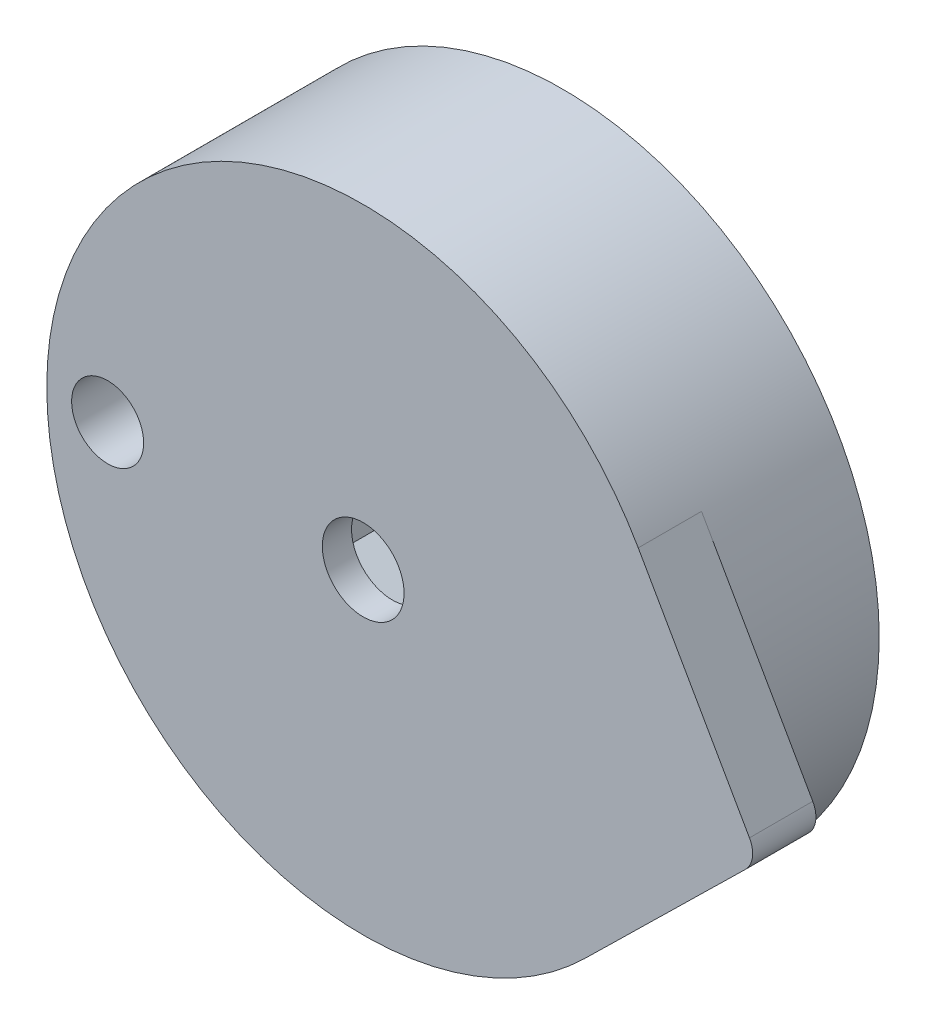
ISO-10303-21;
HEADER;
FILE_DESCRIPTION(('STEP AP214'),'2;1');
FILE_NAME('part.step','',(''),(''),'','','');
FILE_SCHEMA(('AUTOMOTIVE_DESIGN { 1 0 10303 214 1 1 1 1 }'));
ENDSEC;
DATA;
#1=APPLICATION_CONTEXT('core data for automotive mechanical design processes');
#2=APPLICATION_PROTOCOL_DEFINITION('international standard','automotive_design',2000,#1);
#3=PRODUCT_CONTEXT('',#1,'mechanical');
#4=PRODUCT('Part','Part','',(#3));
#5=PRODUCT_RELATED_PRODUCT_CATEGORY('part','',(#4));
#6=PRODUCT_DEFINITION_FORMATION('','',#4);
#7=PRODUCT_DEFINITION_CONTEXT('part definition',#1,'design');
#8=PRODUCT_DEFINITION('design','',#6,#7);
#9=PRODUCT_DEFINITION_SHAPE('','',#8);
#10=(LENGTH_UNIT() NAMED_UNIT(*) SI_UNIT(.MILLI.,.METRE.));
#11=(NAMED_UNIT(*) PLANE_ANGLE_UNIT() SI_UNIT($,.RADIAN.));
#12=(NAMED_UNIT(*) SI_UNIT($,.STERADIAN.) SOLID_ANGLE_UNIT());
#13=UNCERTAINTY_MEASURE_WITH_UNIT(LENGTH_MEASURE(1.E-05),#10,'distance_accuracy_value','');
#14=(GEOMETRIC_REPRESENTATION_CONTEXT(3) GLOBAL_UNCERTAINTY_ASSIGNED_CONTEXT((#13)) GLOBAL_UNIT_ASSIGNED_CONTEXT((#10,
#11,#12)) REPRESENTATION_CONTEXT('',''));
#15=CARTESIAN_POINT('',(0.,0.,0.));
#16=DIRECTION('',(0.,0.,1.));
#17=DIRECTION('',(1.,0.,0.));
#18=AXIS2_PLACEMENT_3D('',#15,#16,#17);
#19=CARTESIAN_POINT('',(0.,0.,1.));
#20=DIRECTION('',(0.,0.,1.));
#21=DIRECTION('',(1.,0.,0.));
#22=AXIS2_PLACEMENT_3D('',#19,#20,#21);
#23=PLANE('',#22);
#24=CARTESIAN_POINT('',(23.5,7.5,1.));
#25=DIRECTION('',(0.,0.,1.));
#26=DIRECTION('',(1.,0.,0.));
#27=AXIS2_PLACEMENT_3D('',#24,#25,#26);
#28=CIRCLE('',#27,15.);
#29=CARTESIAN_POINT('',(38.5,7.5,1.));
#30=VERTEX_POINT('',#29);
#31=EDGE_CURVE('E243',#30,#30,#28,.F.);
#32=ORIENTED_EDGE('',*,*,#31,.F.);
#33=EDGE_LOOP('',(#32));
#34=FACE_BOUND('',#33,.T.);
#35=CARTESIAN_POINT('',(23.5,7.49999999999992,1.));
#36=DIRECTION('',(0.,0.,-1.));
#37=DIRECTION('',(-1.,0.,0.));
#38=AXIS2_PLACEMENT_3D('',#35,#36,#37);
#39=CIRCLE('',#38,20.);
#40=CARTESIAN_POINT('',(3.50000000000003,7.49999999999992,1.));
#41=VERTEX_POINT('',#40);
#42=EDGE_CURVE('E193',#41,#41,#39,.T.);
#43=ORIENTED_EDGE('',*,*,#42,.T.);
#44=EDGE_LOOP('',(#43));
#45=FACE_BOUND('',#44,.T.);
#46=ADVANCED_FACE('F71',(#34,#45),#23,.F.);
#47=CARTESIAN_POINT('',(23.5,7.5,7.));
#48=DIRECTION('',(0.,0.,-1.));
#49=DIRECTION('',(-1.,0.,0.));
#50=AXIS2_PLACEMENT_3D('',#47,#48,#49);
#51=CYLINDRICAL_SURFACE('',#50,32.5);
#52=DIRECTION('',(0.,0.,-1.));
#53=VECTOR('',#52,1.);
#54=CARTESIAN_POINT('',(46.2507534643621,-15.7089038259849,50.3984657703055));
#55=LINE('',#54,#53);
#56=CARTESIAN_POINT('',(46.2507534643621,-15.7089038259849,7.5));
#57=VERTEX_POINT('',#56);
#58=CARTESIAN_POINT('',(46.2507534643621,-15.7089038259849,1.));
#59=VERTEX_POINT('',#58);
#60=EDGE_CURVE('E184',#57,#59,#55,.T.);
#61=ORIENTED_EDGE('',*,*,#60,.F.);
#62=CARTESIAN_POINT('',(23.5,7.5,7.5));
#63=DIRECTION('',(0.,0.,1.));
#64=DIRECTION('',(1.,0.,0.));
#65=AXIS2_PLACEMENT_3D('',#62,#63,#64);
#66=CIRCLE('',#65,32.5);
#67=CARTESIAN_POINT('',(51.7496388463479,23.5688489024855,7.5));
#68=VERTEX_POINT('',#67);
#69=EDGE_CURVE('E222',#68,#57,#66,.T.);
#70=ORIENTED_EDGE('',*,*,#69,.F.);
#71=DIRECTION('',(0.,0.,-1.));
#72=VECTOR('',#71,1.);
#73=CARTESIAN_POINT('',(51.7496388463479,23.5688489024855,50.3984657703055));
#74=LINE('',#73,#72);
#75=CARTESIAN_POINT('',(51.7496388463479,23.5688489024855,1.));
#76=VERTEX_POINT('',#75);
#77=EDGE_CURVE('E87',#68,#76,#74,.T.);
#78=ORIENTED_EDGE('',*,*,#77,.T.);
#79=CARTESIAN_POINT('',(23.5,7.5,1.));
#80=DIRECTION('',(0.,0.,-1.));
#81=DIRECTION('',(-1.,0.,0.));
#82=AXIS2_PLACEMENT_3D('',#79,#80,#81);
#83=CIRCLE('',#82,32.5);
#84=EDGE_CURVE('E176',#76,#59,#83,.T.);
#85=ORIENTED_EDGE('',*,*,#84,.T.);
#86=EDGE_LOOP('',(#61,#70,#78,#85));
#87=FACE_BOUND('',#86,.T.);
#88=CARTESIAN_POINT('',(23.5,7.5,-13.));
#89=DIRECTION('',(0.,0.,-1.));
#90=DIRECTION('',(-1.,0.,0.));
#91=AXIS2_PLACEMENT_3D('',#88,#89,#90);
#92=CIRCLE('',#91,32.5);
#93=CARTESIAN_POINT('',(-9.00000000000001,7.5,-13.));
#94=VERTEX_POINT('',#93);
#95=EDGE_CURVE('E197',#94,#94,#92,.T.);
#96=ORIENTED_EDGE('',*,*,#95,.F.);
#97=EDGE_LOOP('',(#96));
#98=FACE_BOUND('',#97,.T.);
#99=ADVANCED_FACE('F191',(#87,#98),#51,.T.);
#100=CARTESIAN_POINT('',(23.5,7.5,9.));
#101=DIRECTION('',(0.,0.,-1.));
#102=DIRECTION('',(-1.,0.,0.));
#103=AXIS2_PLACEMENT_3D('',#100,#101,#102);
#104=CYLINDRICAL_SURFACE('',#103,4.2);
#105=CARTESIAN_POINT('',(23.5,7.5,4.5));
#106=DIRECTION('',(0.,0.,-1.));
#107=DIRECTION('',(-1.,0.,0.));
#108=AXIS2_PLACEMENT_3D('',#105,#106,#107);
#109=CIRCLE('',#108,4.2);
#110=CARTESIAN_POINT('',(19.3,7.5,4.5));
#111=VERTEX_POINT('',#110);
#112=EDGE_CURVE('E225',#111,#111,#109,.T.);
#113=ORIENTED_EDGE('',*,*,#112,.T.);
#114=EDGE_LOOP('',(#113));
#115=FACE_BOUND('',#114,.T.);
#116=CARTESIAN_POINT('',(23.5,7.5,7.5));
#117=DIRECTION('',(0.,0.,-1.));
#118=DIRECTION('',(-1.,0.,0.));
#119=AXIS2_PLACEMENT_3D('',#116,#117,#118);
#120=CIRCLE('',#119,4.2);
#121=CARTESIAN_POINT('',(19.3,7.5,7.5));
#122=VERTEX_POINT('',#121);
#123=EDGE_CURVE('E219',#122,#122,#120,.T.);
#124=ORIENTED_EDGE('',*,*,#123,.F.);
#125=EDGE_LOOP('',(#124));
#126=FACE_BOUND('',#125,.T.);
#127=ADVANCED_FACE('F326',(#115,#126),#104,.F.);
#128=ORIENTED_EDGE('',*,*,#84,.F.);
#129=DIRECTION('',(-0.494426120076476,0.869219656810706,0.));
#130=VECTOR('',#129,1.);
#131=CARTESIAN_POINT('',(49.2281316914052,28.001753020751,1.));
#132=LINE('',#131,#130);
#133=CARTESIAN_POINT('',(63.1730491420268,3.48606530019119,1.));
#134=VERTEX_POINT('',#133);
#135=EDGE_CURVE('E207',#134,#76,#132,.T.);
#136=ORIENTED_EDGE('',*,*,#135,.F.);
#137=CARTESIAN_POINT('',(61.,2.25,1.));
#138=DIRECTION('',(0.,0.,-1.));
#139=DIRECTION('',(-1.,0.,0.));
#140=AXIS2_PLACEMENT_3D('',#137,#138,#139);
#141=CIRCLE('',#140,2.5);
#142=CARTESIAN_POINT('',(62.7500579587971,0.464699705693465,1.));
#143=VERTEX_POINT('',#142);
#144=EDGE_CURVE('E178',#134,#143,#141,.T.);
#145=ORIENTED_EDGE('',*,*,#144,.T.);
#146=DIRECTION('',(-0.714120117722611,-0.700023183518835,0.));
#147=VECTOR('',#146,1.);
#148=CARTESIAN_POINT('',(30.5172614280897,-31.1318122552048,1.));
#149=LINE('',#148,#147);
#150=EDGE_CURVE('E171',#143,#59,#149,.T.);
#151=ORIENTED_EDGE('',*,*,#150,.T.);
#152=EDGE_LOOP('',(#128,#136,#145,#151));
#153=FACE_BOUND('',#152,.T.);
#154=ADVANCED_FACE('F173',(#153),#23,.F.);
#155=CARTESIAN_POINT('',(16.6,11.4837168574084,7.5));
#156=DIRECTION('',(-0.5,0.866025403784439,0.));
#157=DIRECTION('',(-0.866025403784439,-0.5,0.));
#158=AXIS2_PLACEMENT_3D('',#155,#156,#157);
#159=PLANE('',#158);
#160=DIRECTION('',(0.,0.,-1.));
#161=VECTOR('',#160,1.);
#162=CARTESIAN_POINT('',(16.6,11.4837168574084,7.5));
#163=LINE('',#162,#161);
#164=CARTESIAN_POINT('',(16.6,11.4837168574084,4.5));
#165=VERTEX_POINT('',#164);
#166=CARTESIAN_POINT('',(16.6,11.4837168574084,-1.00000000000003));
#167=VERTEX_POINT('',#166);
#168=EDGE_CURVE('E241',#165,#167,#163,.T.);
#169=ORIENTED_EDGE('',*,*,#168,.T.);
#170=DIRECTION('',(0.866025403784439,0.5,0.));
#171=VECTOR('',#170,1.);
#172=CARTESIAN_POINT('',(23.5,15.4674337148168,-1.00000000000003));
#173=LINE('',#172,#171);
#174=CARTESIAN_POINT('',(23.5,15.4674337148168,-1.00000000000002));
#175=VERTEX_POINT('',#174);
#176=EDGE_CURVE('E279',#167,#175,#173,.T.);
#177=ORIENTED_EDGE('',*,*,#176,.T.);
#178=DIRECTION('',(0.,0.,-1.));
#179=VECTOR('',#178,1.);
#180=CARTESIAN_POINT('',(23.5,15.4674337148168,7.5));
#181=LINE('',#180,#179);
#182=CARTESIAN_POINT('',(23.5,15.4674337148168,4.5));
#183=VERTEX_POINT('',#182);
#184=EDGE_CURVE('E240',#183,#175,#181,.T.);
#185=ORIENTED_EDGE('',*,*,#184,.F.);
#186=DIRECTION('',(0.866025403784439,0.5,0.));
#187=VECTOR('',#186,1.);
#188=CARTESIAN_POINT('',(16.6,11.4837168574084,4.5));
#189=LINE('',#188,#187);
#190=EDGE_CURVE('E230',#165,#183,#189,.T.);
#191=ORIENTED_EDGE('',*,*,#190,.F.);
#192=EDGE_LOOP('',(#169,#177,#185,#191));
#193=FACE_BOUND('',#192,.T.);
#194=ADVANCED_FACE('F332',(#193),#159,.F.);
#195=CARTESIAN_POINT('',(16.6,3.51628314259158,7.5));
#196=DIRECTION('',(-1.,0.,0.));
#197=DIRECTION('',(0.,0.,1.));
#198=AXIS2_PLACEMENT_3D('',#195,#196,#197);
#199=PLANE('',#198);
#200=DIRECTION('',(0.,0.,-1.));
#201=VECTOR('',#200,1.);
#202=CARTESIAN_POINT('',(16.6,3.51628314259158,7.5));
#203=LINE('',#202,#201);
#204=CARTESIAN_POINT('',(16.6,3.51628314259158,4.5));
#205=VERTEX_POINT('',#204);
#206=CARTESIAN_POINT('',(16.6,3.51628314259158,-1.00000000000002));
#207=VERTEX_POINT('',#206);
#208=EDGE_CURVE('E244',#205,#207,#203,.T.);
#209=ORIENTED_EDGE('',*,*,#208,.T.);
#210=DIRECTION('',(0.,1.,0.));
#211=VECTOR('',#210,1.);
#212=CARTESIAN_POINT('',(16.6,11.4837168574084,-1.00000000000003));
#213=LINE('',#212,#211);
#214=EDGE_CURVE('E276',#207,#167,#213,.T.);
#215=ORIENTED_EDGE('',*,*,#214,.T.);
#216=ORIENTED_EDGE('',*,*,#168,.F.);
#217=DIRECTION('',(0.,1.,0.));
#218=VECTOR('',#217,1.);
#219=CARTESIAN_POINT('',(16.6,3.51628314259158,4.5));
#220=LINE('',#219,#218);
#221=EDGE_CURVE('E228',#205,#165,#220,.T.);
#222=ORIENTED_EDGE('',*,*,#221,.F.);
#223=EDGE_LOOP('',(#209,#215,#216,#222));
#224=FACE_BOUND('',#223,.T.);
#225=ADVANCED_FACE('F337',(#224),#199,.F.);
#226=CARTESIAN_POINT('',(23.5,-0.467433714816838,7.5));
#227=DIRECTION('',(-0.5,-0.866025403784439,0.));
#228=DIRECTION('',(0.866025403784439,-0.5,0.));
#229=AXIS2_PLACEMENT_3D('',#226,#227,#228);
#230=PLANE('',#229);
#231=DIRECTION('',(0.,0.,-1.));
#232=VECTOR('',#231,1.);
#233=CARTESIAN_POINT('',(23.5,-0.467433714816838,7.5));
#234=LINE('',#233,#232);
#235=CARTESIAN_POINT('',(23.5,-0.467433714816838,4.5));
#236=VERTEX_POINT('',#235);
#237=CARTESIAN_POINT('',(23.5,-0.467433714816838,-1.00000000000002));
#238=VERTEX_POINT('',#237);
#239=EDGE_CURVE('E246',#236,#238,#234,.T.);
#240=ORIENTED_EDGE('',*,*,#239,.T.);
#241=DIRECTION('',(-0.866025403784439,0.5,0.));
#242=VECTOR('',#241,1.);
#243=CARTESIAN_POINT('',(16.6,3.51628314259158,-1.00000000000003));
#244=LINE('',#243,#242);
#245=EDGE_CURVE('E260',#238,#207,#244,.T.);
#246=ORIENTED_EDGE('',*,*,#245,.T.);
#247=ORIENTED_EDGE('',*,*,#208,.F.);
#248=DIRECTION('',(-0.866025403784439,0.5,0.));
#249=VECTOR('',#248,1.);
#250=CARTESIAN_POINT('',(23.5,-0.467433714816838,4.5));
#251=LINE('',#250,#249);
#252=EDGE_CURVE('E238',#236,#205,#251,.T.);
#253=ORIENTED_EDGE('',*,*,#252,.F.);
#254=EDGE_LOOP('',(#240,#246,#247,#253));
#255=FACE_BOUND('',#254,.T.);
#256=ADVANCED_FACE('F352',(#255),#230,.F.);
#257=CARTESIAN_POINT('',(30.4,3.51628314259158,7.5));
#258=DIRECTION('',(0.5,-0.866025403784439,0.));
#259=DIRECTION('',(0.866025403784439,0.5,0.));
#260=AXIS2_PLACEMENT_3D('',#257,#258,#259);
#261=PLANE('',#260);
#262=DIRECTION('',(0.,0.,-1.));
#263=VECTOR('',#262,1.);
#264=CARTESIAN_POINT('',(30.4,3.51628314259158,7.5));
#265=LINE('',#264,#263);
#266=CARTESIAN_POINT('',(30.4,3.51628314259158,4.5));
#267=VERTEX_POINT('',#266);
#268=CARTESIAN_POINT('',(30.4,3.51628314259158,-1.00000000000002));
#269=VERTEX_POINT('',#268);
#270=EDGE_CURVE('E95',#267,#269,#265,.T.);
#271=ORIENTED_EDGE('',*,*,#270,.T.);
#272=DIRECTION('',(-0.866025403784439,-0.5,0.));
#273=VECTOR('',#272,1.);
#274=CARTESIAN_POINT('',(23.5,-0.467433714816837,-1.00000000000003));
#275=LINE('',#274,#273);
#276=EDGE_CURVE('E287',#269,#238,#275,.T.);
#277=ORIENTED_EDGE('',*,*,#276,.T.);
#278=ORIENTED_EDGE('',*,*,#239,.F.);
#279=DIRECTION('',(-0.866025403784439,-0.5,0.));
#280=VECTOR('',#279,1.);
#281=CARTESIAN_POINT('',(30.4,3.51628314259158,4.5));
#282=LINE('',#281,#280);
#283=EDGE_CURVE('E236',#267,#236,#282,.T.);
#284=ORIENTED_EDGE('',*,*,#283,.F.);
#285=EDGE_LOOP('',(#271,#277,#278,#284));
#286=FACE_BOUND('',#285,.T.);
#287=ADVANCED_FACE('F356',(#286),#261,.F.);
#288=CARTESIAN_POINT('',(30.4,11.4837168574084,7.5));
#289=DIRECTION('',(1.,0.,0.));
#290=DIRECTION('',(0.,0.,-1.));
#291=AXIS2_PLACEMENT_3D('',#288,#289,#290);
#292=PLANE('',#291);
#293=DIRECTION('',(0.,0.,-1.));
#294=VECTOR('',#293,1.);
#295=CARTESIAN_POINT('',(30.4,11.4837168574084,7.5));
#296=LINE('',#295,#294);
#297=CARTESIAN_POINT('',(30.4,11.4837168574084,4.5));
#298=VERTEX_POINT('',#297);
#299=CARTESIAN_POINT('',(30.4,11.4837168574084,-1.00000000000002));
#300=VERTEX_POINT('',#299);
#301=EDGE_CURVE('E249',#298,#300,#296,.T.);
#302=ORIENTED_EDGE('',*,*,#301,.T.);
#303=DIRECTION('',(0.,-1.,0.));
#304=VECTOR('',#303,1.);
#305=CARTESIAN_POINT('',(30.4,3.51628314259158,-1.00000000000003));
#306=LINE('',#305,#304);
#307=EDGE_CURVE('E285',#300,#269,#306,.T.);
#308=ORIENTED_EDGE('',*,*,#307,.T.);
#309=ORIENTED_EDGE('',*,*,#270,.F.);
#310=DIRECTION('',(0.,-1.,0.));
#311=VECTOR('',#310,1.);
#312=CARTESIAN_POINT('',(30.4,11.4837168574084,4.5));
#313=LINE('',#312,#311);
#314=EDGE_CURVE('E234',#298,#267,#313,.T.);
#315=ORIENTED_EDGE('',*,*,#314,.F.);
#316=EDGE_LOOP('',(#302,#308,#309,#315));
#317=FACE_BOUND('',#316,.T.);
#318=ADVANCED_FACE('F360',(#317),#292,.F.);
#319=CARTESIAN_POINT('',(23.5,15.4674337148168,7.5));
#320=DIRECTION('',(0.5,0.866025403784439,0.));
#321=DIRECTION('',(-0.866025403784439,0.5,0.));
#322=AXIS2_PLACEMENT_3D('',#319,#320,#321);
#323=PLANE('',#322);
#324=ORIENTED_EDGE('',*,*,#184,.T.);
#325=DIRECTION('',(0.866025403784439,-0.5,0.));
#326=VECTOR('',#325,1.);
#327=CARTESIAN_POINT('',(30.4,11.4837168574084,-1.00000000000003));
#328=LINE('',#327,#326);
#329=EDGE_CURVE('E282',#175,#300,#328,.T.);
#330=ORIENTED_EDGE('',*,*,#329,.T.);
#331=ORIENTED_EDGE('',*,*,#301,.F.);
#332=DIRECTION('',(0.866025403784439,-0.5,0.));
#333=VECTOR('',#332,1.);
#334=CARTESIAN_POINT('',(23.5,15.4674337148168,4.5));
#335=LINE('',#334,#333);
#336=EDGE_CURVE('E232',#183,#298,#335,.T.);
#337=ORIENTED_EDGE('',*,*,#336,.F.);
#338=EDGE_LOOP('',(#324,#330,#331,#337));
#339=FACE_BOUND('',#338,.T.);
#340=ADVANCED_FACE('F363',(#339),#323,.F.);
#341=CARTESIAN_POINT('',(23.5,7.5,-2.));
#342=DIRECTION('',(0.,0.,-1.));
#343=DIRECTION('',(-1.,0.,0.));
#344=AXIS2_PLACEMENT_3D('',#341,#342,#343);
#345=PLANE('',#344);
#346=DIRECTION('',(0.,-1.,0.));
#347=VECTOR('',#346,1.);
#348=CARTESIAN_POINT('',(15.6,3.51628314259158,-2.));
#349=LINE('',#348,#347);
#350=CARTESIAN_POINT('',(15.6,12.061067126598,-2.));
#351=VERTEX_POINT('',#350);
#352=CARTESIAN_POINT('',(15.6,2.93893287340196,-2.));
#353=VERTEX_POINT('',#352);
#354=EDGE_CURVE('E271',#351,#353,#349,.T.);
#355=ORIENTED_EDGE('',*,*,#354,.T.);
#356=DIRECTION('',(0.866025403784439,-0.5,0.));
#357=VECTOR('',#356,1.);
#358=CARTESIAN_POINT('',(23.,-1.33345911860126,-2.));
#359=LINE('',#358,#357);
#360=CARTESIAN_POINT('',(23.5,-1.62213425319607,-2.));
#361=VERTEX_POINT('',#360);
#362=EDGE_CURVE('E273',#353,#361,#359,.T.);
#363=ORIENTED_EDGE('',*,*,#362,.T.);
#364=DIRECTION('',(0.866025403784439,0.5,0.));
#365=VECTOR('',#364,1.);
#366=CARTESIAN_POINT('',(30.9,2.65025773880716,-2.));
#367=LINE('',#366,#365);
#368=CARTESIAN_POINT('',(31.4,2.93893287340197,-2.));
#369=VERTEX_POINT('',#368);
#370=EDGE_CURVE('E263',#361,#369,#367,.T.);
#371=ORIENTED_EDGE('',*,*,#370,.T.);
#372=DIRECTION('',(0.,1.,0.));
#373=VECTOR('',#372,1.);
#374=CARTESIAN_POINT('',(31.4,11.4837168574084,-2.));
#375=LINE('',#374,#373);
#376=CARTESIAN_POINT('',(31.4,12.061067126598,-2.));
#377=VERTEX_POINT('',#376);
#378=EDGE_CURVE('E265',#369,#377,#375,.T.);
#379=ORIENTED_EDGE('',*,*,#378,.T.);
#380=DIRECTION('',(-0.866025403784439,0.5,0.));
#381=VECTOR('',#380,1.);
#382=CARTESIAN_POINT('',(24.,16.3334591186013,-2.));
#383=LINE('',#382,#381);
#384=CARTESIAN_POINT('',(23.5,16.6221342531961,-2.));
#385=VERTEX_POINT('',#384);
#386=EDGE_CURVE('E267',#377,#385,#383,.T.);
#387=ORIENTED_EDGE('',*,*,#386,.T.);
#388=DIRECTION('',(-0.866025403784439,-0.5,0.));
#389=VECTOR('',#388,1.);
#390=CARTESIAN_POINT('',(16.1,12.3497422611928,-2.));
#391=LINE('',#390,#389);
#392=EDGE_CURVE('E269',#385,#351,#391,.T.);
#393=ORIENTED_EDGE('',*,*,#392,.T.);
#394=EDGE_LOOP('',(#355,#363,#371,#379,#387,#393));
#395=FACE_BOUND('',#394,.T.);
#396=CARTESIAN_POINT('',(23.5,7.5,-2.));
#397=DIRECTION('',(0.,0.,-1.));
#398=DIRECTION('',(-1.,0.,0.));
#399=AXIS2_PLACEMENT_3D('',#396,#397,#398);
#400=CIRCLE('',#399,13.5);
#401=CARTESIAN_POINT('',(10.,7.5,-2.));
#402=VERTEX_POINT('',#401);
#403=EDGE_CURVE('E254',#402,#402,#400,.T.);
#404=ORIENTED_EDGE('',*,*,#403,.T.);
#405=EDGE_LOOP('',(#404));
#406=FACE_BOUND('',#405,.T.);
#407=ADVANCED_FACE('F366',(#395,#406),#345,.T.);
#408=CARTESIAN_POINT('',(23.5,7.5,-2.));
#409=DIRECTION('',(0.,0.,1.));
#410=DIRECTION('',(1.,0.,0.));
#411=AXIS2_PLACEMENT_3D('',#408,#409,#410);
#412=CYLINDRICAL_SURFACE('',#411,15.);
#413=CARTESIAN_POINT('',(23.5,7.5,-0.5));
#414=DIRECTION('',(0.,0.,-1.));
#415=DIRECTION('',(-1.,0.,0.));
#416=AXIS2_PLACEMENT_3D('',#413,#414,#415);
#417=CIRCLE('',#416,15.);
#418=CARTESIAN_POINT('',(8.5,7.5,-0.5));
#419=VERTEX_POINT('',#418);
#420=EDGE_CURVE('E257',#419,#419,#417,.F.);
#421=ORIENTED_EDGE('',*,*,#420,.T.);
#422=EDGE_LOOP('',(#421));
#423=FACE_BOUND('',#422,.T.);
#424=ORIENTED_EDGE('',*,*,#31,.T.);
#425=EDGE_LOOP('',(#424));
#426=FACE_BOUND('',#425,.T.);
#427=ADVANCED_FACE('F348',(#423,#426),#412,.T.);
#428=CARTESIAN_POINT('',(0.,0.,4.5));
#429=DIRECTION('',(0.,0.,-1.));
#430=DIRECTION('',(-1.,0.,0.));
#431=AXIS2_PLACEMENT_3D('',#428,#429,#430);
#432=PLANE('',#431);
#433=ORIENTED_EDGE('',*,*,#221,.T.);
#434=ORIENTED_EDGE('',*,*,#190,.T.);
#435=ORIENTED_EDGE('',*,*,#336,.T.);
#436=ORIENTED_EDGE('',*,*,#314,.T.);
#437=ORIENTED_EDGE('',*,*,#283,.T.);
#438=ORIENTED_EDGE('',*,*,#252,.T.);
#439=EDGE_LOOP('',(#433,#434,#435,#436,#437,#438));
#440=FACE_BOUND('',#439,.T.);
#441=ORIENTED_EDGE('',*,*,#112,.F.);
#442=EDGE_LOOP('',(#441));
#443=FACE_BOUND('',#442,.T.);
#444=ADVANCED_FACE('F399',(#440,#443),#432,.T.);
#445=CARTESIAN_POINT('',(23.5,7.5,-0.5));
#446=DIRECTION('',(0.,0.,-1.));
#447=DIRECTION('',(-1.,0.,0.));
#448=AXIS2_PLACEMENT_3D('',#445,#446,#447);
#449=TOROIDAL_SURFACE('',#448,13.5,1.5);
#450=ORIENTED_EDGE('',*,*,#420,.F.);
#451=EDGE_LOOP('',(#450));
#452=FACE_BOUND('',#451,.T.);
#453=ORIENTED_EDGE('',*,*,#403,.F.);
#454=EDGE_LOOP('',(#453));
#455=FACE_BOUND('',#454,.T.);
#456=ADVANCED_FACE('F445',(#452,#455),#449,.T.);
#457=CARTESIAN_POINT('',(23.5,7.5,7.5));
#458=DIRECTION('',(0.,0.,1.));
#459=DIRECTION('',(1.,0.,0.));
#460=AXIS2_PLACEMENT_3D('',#457,#458,#459);
#461=PLANE('',#460);
#462=CARTESIAN_POINT('',(-2.74999999999999,7.49999999999998,7.5));
#463=DIRECTION('',(0.,0.,-1.));
#464=DIRECTION('',(-1.,0.,0.));
#465=AXIS2_PLACEMENT_3D('',#462,#463,#464);
#466=CIRCLE('',#465,3.7);
#467=CARTESIAN_POINT('',(-6.44999999999999,7.49999999999998,7.5));
#468=VERTEX_POINT('',#467);
#469=EDGE_CURVE('E194',#468,#468,#466,.T.);
#470=ORIENTED_EDGE('',*,*,#469,.T.);
#471=EDGE_LOOP('',(#470));
#472=FACE_BOUND('',#471,.T.);
#473=ORIENTED_EDGE('',*,*,#123,.T.);
#474=EDGE_LOOP('',(#473));
#475=FACE_BOUND('',#474,.T.);
#476=ORIENTED_EDGE('',*,*,#69,.T.);
#477=DIRECTION('',(-0.714120117722611,-0.700023183518835,0.));
#478=VECTOR('',#477,1.);
#479=CARTESIAN_POINT('',(30.5172614280897,-31.1318122552048,7.5));
#480=LINE('',#479,#478);
#481=CARTESIAN_POINT('',(62.7500579587971,0.464699705693465,7.5));
#482=VERTEX_POINT('',#481);
#483=EDGE_CURVE('E186',#482,#57,#480,.T.);
#484=ORIENTED_EDGE('',*,*,#483,.F.);
#485=CARTESIAN_POINT('',(61.,2.25,7.5));
#486=DIRECTION('',(0.,0.,1.));
#487=DIRECTION('',(1.,0.,0.));
#488=AXIS2_PLACEMENT_3D('',#485,#486,#487);
#489=CIRCLE('',#488,2.5);
#490=CARTESIAN_POINT('',(63.1730491420268,3.48606530019119,7.5));
#491=VERTEX_POINT('',#490);
#492=EDGE_CURVE('E181',#491,#482,#489,.F.);
#493=ORIENTED_EDGE('',*,*,#492,.F.);
#494=DIRECTION('',(-0.494426120076476,0.869219656810706,0.));
#495=VECTOR('',#494,1.);
#496=CARTESIAN_POINT('',(49.2281316914052,28.001753020751,7.5));
#497=LINE('',#496,#495);
#498=EDGE_CURVE('E206',#491,#68,#497,.T.);
#499=ORIENTED_EDGE('',*,*,#498,.T.);
#500=EDGE_LOOP('',(#476,#484,#493,#499));
#501=FACE_BOUND('',#500,.T.);
#502=ADVANCED_FACE('F441',(#472,#475,#501),#461,.T.);
#503=CARTESIAN_POINT('',(23.5,15.4674337148168,-1.00000000000003));
#504=DIRECTION('',(-0.353553390593273,-0.612372435695793,-0.707106781186549));
#505=DIRECTION('',(-0.866025403784439,0.5,0.));
#506=AXIS2_PLACEMENT_3D('',#503,#504,#505);
#507=PLANE('',#506);
#508=DIRECTION('',(0.,0.755928946018457,-0.654653670707974));
#509=VECTOR('',#508,1.);
#510=CARTESIAN_POINT('',(23.5,13.191024082012,0.971428571428528));
#511=LINE('',#510,#509);
#512=EDGE_CURVE('E299',#385,#175,#511,.F.);
#513=ORIENTED_EDGE('',*,*,#512,.F.);
#514=ORIENTED_EDGE('',*,*,#386,.F.);
#515=DIRECTION('',(0.654653670707979,0.377964473009227,-0.654653670707975));
#516=VECTOR('',#515,1.);
#517=CARTESIAN_POINT('',(28.4285714285714,10.345512041006,0.971428571428548));
#518=LINE('',#517,#516);
#519=EDGE_CURVE('E223',#300,#377,#518,.T.);
#520=ORIENTED_EDGE('',*,*,#519,.F.);
#521=ORIENTED_EDGE('',*,*,#329,.F.);
#522=EDGE_LOOP('',(#513,#514,#520,#521));
#523=FACE_BOUND('',#522,.T.);
#524=ADVANCED_FACE('F384',(#523),#507,.T.);
#525=CARTESIAN_POINT('',(30.4,11.4837168574084,-1.00000000000003));
#526=DIRECTION('',(-0.707106781186545,0.,-0.70710678118655));
#527=DIRECTION('',(0.,1.,0.));
#528=AXIS2_PLACEMENT_3D('',#525,#526,#527);
#529=PLANE('',#528);
#530=ORIENTED_EDGE('',*,*,#519,.T.);
#531=ORIENTED_EDGE('',*,*,#378,.F.);
#532=DIRECTION('',(0.654653670707979,-0.377964473009228,-0.654653670707975));
#533=VECTOR('',#532,1.);
#534=CARTESIAN_POINT('',(28.4285714285714,4.65448795899399,0.971428571428542));
#535=LINE('',#534,#533);
#536=EDGE_CURVE('E296',#269,#369,#535,.T.);
#537=ORIENTED_EDGE('',*,*,#536,.F.);
#538=ORIENTED_EDGE('',*,*,#307,.F.);
#539=EDGE_LOOP('',(#530,#531,#537,#538));
#540=FACE_BOUND('',#539,.T.);
#541=ADVANCED_FACE('F394',(#540),#529,.T.);
#542=CARTESIAN_POINT('',(16.6,11.4837168574084,-1.00000000000003));
#543=DIRECTION('',(0.353553390593272,-0.612372435695792,-0.707106781186551));
#544=DIRECTION('',(-0.866025403784439,-0.5,0.));
#545=AXIS2_PLACEMENT_3D('',#542,#543,#544);
#546=PLANE('',#545);
#547=ORIENTED_EDGE('',*,*,#512,.T.);
#548=ORIENTED_EDGE('',*,*,#176,.F.);
#549=DIRECTION('',(-0.654653670707978,0.377964473009231,-0.654653670707974));
#550=VECTOR('',#549,1.);
#551=CARTESIAN_POINT('',(18.5714285714286,10.345512041006,0.971428571428557));
#552=LINE('',#551,#550);
#553=EDGE_CURVE('E293',#351,#167,#552,.F.);
#554=ORIENTED_EDGE('',*,*,#553,.F.);
#555=ORIENTED_EDGE('',*,*,#392,.F.);
#556=EDGE_LOOP('',(#547,#548,#554,#555));
#557=FACE_BOUND('',#556,.T.);
#558=ADVANCED_FACE('F388',(#557),#546,.T.);
#559=CARTESIAN_POINT('',(30.4,3.51628314259158,-1.00000000000003));
#560=DIRECTION('',(-0.353553390593273,0.612372435695792,-0.70710678118655));
#561=DIRECTION('',(0.866025403784439,0.5,0.));
#562=AXIS2_PLACEMENT_3D('',#559,#560,#561);
#563=PLANE('',#562);
#564=ORIENTED_EDGE('',*,*,#536,.T.);
#565=ORIENTED_EDGE('',*,*,#370,.F.);
#566=DIRECTION('',(0.,0.755928946018457,0.654653670707975));
#567=VECTOR('',#566,1.);
#568=CARTESIAN_POINT('',(23.5,-0.467433714816838,-1.00000000000003));
#569=LINE('',#568,#567);
#570=EDGE_CURVE('E291',#238,#361,#569,.F.);
#571=ORIENTED_EDGE('',*,*,#570,.F.);
#572=ORIENTED_EDGE('',*,*,#276,.F.);
#573=EDGE_LOOP('',(#564,#565,#571,#572));
#574=FACE_BOUND('',#573,.T.);
#575=ADVANCED_FACE('F415',(#574),#563,.T.);
#576=CARTESIAN_POINT('',(16.6,3.51628314259158,-1.00000000000003));
#577=DIRECTION('',(0.707106781186546,0.,-0.707106781186549));
#578=DIRECTION('',(0.,-1.,0.));
#579=AXIS2_PLACEMENT_3D('',#576,#577,#578);
#580=PLANE('',#579);
#581=ORIENTED_EDGE('',*,*,#553,.T.);
#582=ORIENTED_EDGE('',*,*,#214,.F.);
#583=DIRECTION('',(-0.654653670707978,-0.377964473009229,-0.654653670707975));
#584=VECTOR('',#583,1.);
#585=CARTESIAN_POINT('',(18.5714285714286,4.65448795899399,0.97142857142854));
#586=LINE('',#585,#584);
#587=EDGE_CURVE('E209',#353,#207,#586,.F.);
#588=ORIENTED_EDGE('',*,*,#587,.F.);
#589=ORIENTED_EDGE('',*,*,#354,.F.);
#590=EDGE_LOOP('',(#581,#582,#588,#589));
#591=FACE_BOUND('',#590,.T.);
#592=ADVANCED_FACE('F410',(#591),#580,.T.);
#593=CARTESIAN_POINT('',(23.5,-0.467433714816838,-1.00000000000003));
#594=DIRECTION('',(0.353553390593272,0.612372435695793,-0.70710678118655));
#595=DIRECTION('',(0.866025403784439,-0.5,0.));
#596=AXIS2_PLACEMENT_3D('',#593,#594,#595);
#597=PLANE('',#596);
#598=ORIENTED_EDGE('',*,*,#570,.T.);
#599=ORIENTED_EDGE('',*,*,#362,.F.);
#600=ORIENTED_EDGE('',*,*,#587,.T.);
#601=ORIENTED_EDGE('',*,*,#245,.F.);
#602=EDGE_LOOP('',(#598,#599,#600,#601));
#603=FACE_BOUND('',#602,.T.);
#604=ADVANCED_FACE('F412',(#603),#597,.T.);
#605=CARTESIAN_POINT('',(61.,2.25,50.3984657703055));
#606=DIRECTION('',(0.,0.,-1.));
#607=DIRECTION('',(-1.,0.,0.));
#608=AXIS2_PLACEMENT_3D('',#605,#606,#607);
#609=CYLINDRICAL_SURFACE('',#608,2.5);
#610=DIRECTION('',(0.,0.,-1.));
#611=VECTOR('',#610,1.);
#612=CARTESIAN_POINT('',(63.1730491420268,3.48606530019119,50.3984657703055));
#613=LINE('',#612,#611);
#614=EDGE_CURVE('E210',#491,#134,#613,.T.);
#615=ORIENTED_EDGE('',*,*,#614,.F.);
#616=ORIENTED_EDGE('',*,*,#492,.T.);
#617=DIRECTION('',(0.,0.,-1.));
#618=VECTOR('',#617,1.);
#619=CARTESIAN_POINT('',(62.7500579587971,0.464699705693465,50.3984657703055));
#620=LINE('',#619,#618);
#621=EDGE_CURVE('E213',#482,#143,#620,.T.);
#622=ORIENTED_EDGE('',*,*,#621,.T.);
#623=ORIENTED_EDGE('',*,*,#144,.F.);
#624=EDGE_LOOP('',(#615,#616,#622,#623));
#625=FACE_BOUND('',#624,.T.);
#626=ADVANCED_FACE('F456',(#625),#609,.T.);
#627=CARTESIAN_POINT('',(30.5172614280897,-31.1318122552048,50.3984657703055));
#628=DIRECTION('',(0.700023183518835,-0.714120117722611,0.));
#629=DIRECTION('',(0.714120117722611,0.700023183518835,0.));
#630=AXIS2_PLACEMENT_3D('',#627,#628,#629);
#631=PLANE('',#630);
#632=ORIENTED_EDGE('',*,*,#621,.F.);
#633=ORIENTED_EDGE('',*,*,#483,.T.);
#634=ORIENTED_EDGE('',*,*,#60,.T.);
#635=ORIENTED_EDGE('',*,*,#150,.F.);
#636=EDGE_LOOP('',(#632,#633,#634,#635));
#637=FACE_BOUND('',#636,.T.);
#638=ADVANCED_FACE('F185',(#637),#631,.T.);
#639=CARTESIAN_POINT('',(49.2281316914052,28.001753020751,50.3984657703055));
#640=DIRECTION('',(-0.869219656810706,-0.494426120076476,0.));
#641=DIRECTION('',(0.494426120076476,-0.869219656810706,0.));
#642=AXIS2_PLACEMENT_3D('',#639,#640,#641);
#643=PLANE('',#642);
#644=ORIENTED_EDGE('',*,*,#498,.F.);
#645=ORIENTED_EDGE('',*,*,#614,.T.);
#646=ORIENTED_EDGE('',*,*,#135,.T.);
#647=ORIENTED_EDGE('',*,*,#77,.F.);
#648=EDGE_LOOP('',(#644,#645,#646,#647));
#649=FACE_BOUND('',#648,.T.);
#650=ADVANCED_FACE('F521',(#649),#643,.F.);
#651=CARTESIAN_POINT('',(-2.74999999999999,7.49999999999998,-13.));
#652=DIRECTION('',(0.,0.,1.));
#653=DIRECTION('',(1.,0.,0.));
#654=AXIS2_PLACEMENT_3D('',#651,#652,#653);
#655=CYLINDRICAL_SURFACE('',#654,3.7);
#656=CARTESIAN_POINT('',(-2.74999999999999,7.49999999999998,-11.5));
#657=DIRECTION('',(0.,0.,-1.));
#658=DIRECTION('',(-1.,0.,0.));
#659=AXIS2_PLACEMENT_3D('',#656,#657,#658);
#660=CIRCLE('',#659,3.7);
#661=CARTESIAN_POINT('',(-6.44999999999999,7.49999999999998,-11.5));
#662=VERTEX_POINT('',#661);
#663=EDGE_CURVE('E80',#662,#662,#660,.T.);
#664=ORIENTED_EDGE('',*,*,#663,.T.);
#665=EDGE_LOOP('',(#664));
#666=FACE_BOUND('',#665,.T.);
#667=ORIENTED_EDGE('',*,*,#469,.F.);
#668=EDGE_LOOP('',(#667));
#669=FACE_BOUND('',#668,.T.);
#670=ADVANCED_FACE('F306',(#666,#669),#655,.F.);
#671=CARTESIAN_POINT('',(23.5,7.49999999999992,-13.));
#672=DIRECTION('',(0.,0.,1.));
#673=DIRECTION('',(1.,0.,0.));
#674=AXIS2_PLACEMENT_3D('',#671,#672,#673);
#675=CYLINDRICAL_SURFACE('',#674,20.);
#676=CARTESIAN_POINT('',(23.5,7.49999999999992,-13.));
#677=DIRECTION('',(0.,0.,-1.));
#678=DIRECTION('',(-1.,0.,0.));
#679=AXIS2_PLACEMENT_3D('',#676,#677,#678);
#680=CIRCLE('',#679,20.);
#681=CARTESIAN_POINT('',(3.50000000000003,7.49999999999992,-13.));
#682=VERTEX_POINT('',#681);
#683=EDGE_CURVE('E202',#682,#682,#680,.T.);
#684=ORIENTED_EDGE('',*,*,#683,.T.);
#685=EDGE_LOOP('',(#684));
#686=FACE_BOUND('',#685,.T.);
#687=ORIENTED_EDGE('',*,*,#42,.F.);
#688=EDGE_LOOP('',(#687));
#689=FACE_BOUND('',#688,.T.);
#690=ADVANCED_FACE('F315',(#686,#689),#675,.F.);
#691=CARTESIAN_POINT('',(0.,0.,-13.));
#692=DIRECTION('',(0.,0.,-1.));
#693=DIRECTION('',(-1.,0.,0.));
#694=AXIS2_PLACEMENT_3D('',#691,#692,#693);
#695=PLANE('',#694);
#696=CARTESIAN_POINT('',(-2.74999999999999,7.49999999999998,-13.));
#697=DIRECTION('',(0.,0.,-1.));
#698=DIRECTION('',(-1.,0.,0.));
#699=AXIS2_PLACEMENT_3D('',#696,#697,#698);
#700=CIRCLE('',#699,5.20000000000001);
#701=CARTESIAN_POINT('',(-7.95,7.49999999999998,-13.));
#702=VERTEX_POINT('',#701);
#703=EDGE_CURVE('E12',#702,#702,#700,.F.);
#704=ORIENTED_EDGE('',*,*,#703,.T.);
#705=EDGE_LOOP('',(#704));
#706=FACE_BOUND('',#705,.T.);
#707=ORIENTED_EDGE('',*,*,#95,.T.);
#708=EDGE_LOOP('',(#707));
#709=FACE_BOUND('',#708,.T.);
#710=ORIENTED_EDGE('',*,*,#683,.F.);
#711=EDGE_LOOP('',(#710));
#712=FACE_BOUND('',#711,.T.);
#713=ADVANCED_FACE('F310',(#706,#709,#712),#695,.T.);
#714=CARTESIAN_POINT('',(-2.74999999999999,7.49999999999998,-11.5));
#715=DIRECTION('',(0.,0.,-1.));
#716=DIRECTION('',(-1.,0.,0.));
#717=AXIS2_PLACEMENT_3D('',#714,#715,#716);
#718=CONICAL_SURFACE('',#717,3.7,0.785398163397449);
#719=ORIENTED_EDGE('',*,*,#703,.F.);
#720=EDGE_LOOP('',(#719));
#721=FACE_BOUND('',#720,.T.);
#722=ORIENTED_EDGE('',*,*,#663,.F.);
#723=EDGE_LOOP('',(#722));
#724=FACE_BOUND('',#723,.T.);
#725=ADVANCED_FACE('F74',(#721,#724),#718,.F.);
#726=CLOSED_SHELL('',(#46,#99,#127,#154,#194,#225,#256,#287,#318,#340,#407,#427,#444,#456,#502,
#524,#541,#558,#575,#592,#604,#626,#638,#650,#670,#690,#713,#725));
#727=MANIFOLD_SOLID_BREP('B2',#726);
#728=ADVANCED_BREP_SHAPE_REPRESENTATION('',(#18,#727),#14);
#729=SHAPE_DEFINITION_REPRESENTATION(#9,#728);
ENDSEC;
END-ISO-10303-21;
